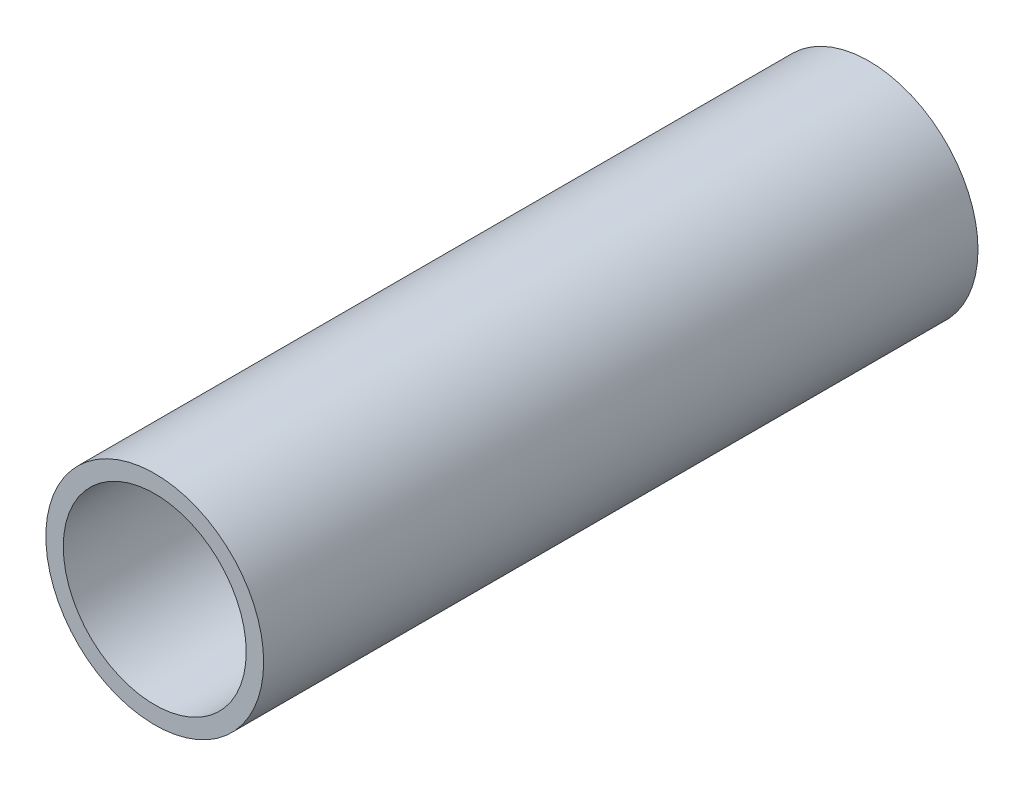
ISO-10303-21;
HEADER;
FILE_DESCRIPTION(('STEP AP214'),'2;1');
FILE_NAME('part.step','',(''),(''),'','','');
FILE_SCHEMA(('AUTOMOTIVE_DESIGN { 1 0 10303 214 1 1 1 1 }'));
ENDSEC;
DATA;
#1=APPLICATION_CONTEXT('core data for automotive mechanical design processes');
#2=APPLICATION_PROTOCOL_DEFINITION('international standard','automotive_design',2000,#1);
#3=PRODUCT_CONTEXT('',#1,'mechanical');
#4=PRODUCT('Part','Part','',(#3));
#5=PRODUCT_RELATED_PRODUCT_CATEGORY('part','',(#4));
#6=PRODUCT_DEFINITION_FORMATION('','',#4);
#7=PRODUCT_DEFINITION_CONTEXT('part definition',#1,'design');
#8=PRODUCT_DEFINITION('design','',#6,#7);
#9=PRODUCT_DEFINITION_SHAPE('','',#8);
#10=(LENGTH_UNIT() NAMED_UNIT(*) SI_UNIT(.MILLI.,.METRE.));
#11=(NAMED_UNIT(*) PLANE_ANGLE_UNIT() SI_UNIT($,.RADIAN.));
#12=(NAMED_UNIT(*) SI_UNIT($,.STERADIAN.) SOLID_ANGLE_UNIT());
#13=UNCERTAINTY_MEASURE_WITH_UNIT(LENGTH_MEASURE(1.E-05),#10,'distance_accuracy_value','');
#14=(GEOMETRIC_REPRESENTATION_CONTEXT(3) GLOBAL_UNCERTAINTY_ASSIGNED_CONTEXT((#13)) GLOBAL_UNIT_ASSIGNED_CONTEXT((#10,
#11,#12)) REPRESENTATION_CONTEXT('',''));
#15=CARTESIAN_POINT('',(0.,0.,0.));
#16=DIRECTION('',(0.,0.,1.));
#17=DIRECTION('',(1.,0.,0.));
#18=AXIS2_PLACEMENT_3D('',#15,#16,#17);
#19=CARTESIAN_POINT('',(0.,0.,82.));
#20=DIRECTION('',(0.,0.,1.));
#21=DIRECTION('',(1.,0.,0.));
#22=AXIS2_PLACEMENT_3D('',#19,#20,#21);
#23=PLANE('',#22);
#24=CARTESIAN_POINT('',(0.,0.,82.));
#25=DIRECTION('',(0.,0.,1.));
#26=DIRECTION('',(1.,0.,0.));
#27=AXIS2_PLACEMENT_3D('',#24,#25,#26);
#28=CIRCLE('',#27,12.5);
#29=CARTESIAN_POINT('',(12.5,0.,82.));
#30=VERTEX_POINT('',#29);
#31=EDGE_CURVE('E10',#30,#30,#28,.T.);
#32=ORIENTED_EDGE('',*,*,#31,.T.);
#33=EDGE_LOOP('',(#32));
#34=FACE_BOUND('',#33,.T.);
#35=CARTESIAN_POINT('',(0.,0.,82.));
#36=DIRECTION('',(0.,0.,1.));
#37=DIRECTION('',(1.,0.,0.));
#38=AXIS2_PLACEMENT_3D('',#35,#36,#37);
#39=CIRCLE('',#38,10.5);
#40=CARTESIAN_POINT('',(10.5,0.,82.));
#41=VERTEX_POINT('',#40);
#42=EDGE_CURVE('E50',#41,#41,#39,.T.);
#43=ORIENTED_EDGE('',*,*,#42,.F.);
#44=EDGE_LOOP('',(#43));
#45=FACE_BOUND('',#44,.T.);
#46=ADVANCED_FACE('F37',(#34,#45),#23,.T.);
#47=CARTESIAN_POINT('',(0.,0.,0.));
#48=DIRECTION('',(0.,0.,1.));
#49=DIRECTION('',(1.,0.,0.));
#50=AXIS2_PLACEMENT_3D('',#47,#48,#49);
#51=PLANE('',#50);
#52=CARTESIAN_POINT('',(0.,0.,0.));
#53=DIRECTION('',(0.,0.,1.));
#54=DIRECTION('',(1.,0.,0.));
#55=AXIS2_PLACEMENT_3D('',#52,#53,#54);
#56=CIRCLE('',#55,12.5);
#57=CARTESIAN_POINT('',(12.5,0.,0.));
#58=VERTEX_POINT('',#57);
#59=EDGE_CURVE('E41',#58,#58,#56,.T.);
#60=ORIENTED_EDGE('',*,*,#59,.F.);
#61=EDGE_LOOP('',(#60));
#62=FACE_BOUND('',#61,.T.);
#63=CARTESIAN_POINT('',(0.,0.,0.));
#64=DIRECTION('',(0.,0.,1.));
#65=DIRECTION('',(1.,0.,0.));
#66=AXIS2_PLACEMENT_3D('',#63,#64,#65);
#67=CIRCLE('',#66,10.5);
#68=CARTESIAN_POINT('',(10.5,0.,0.));
#69=VERTEX_POINT('',#68);
#70=EDGE_CURVE('E52',#69,#69,#67,.T.);
#71=ORIENTED_EDGE('',*,*,#70,.T.);
#72=EDGE_LOOP('',(#71));
#73=FACE_BOUND('',#72,.T.);
#74=ADVANCED_FACE('F64',(#62,#73),#51,.F.);
#75=CARTESIAN_POINT('',(0.,0.,82.));
#76=DIRECTION('',(0.,0.,-1.));
#77=DIRECTION('',(-1.,0.,0.));
#78=AXIS2_PLACEMENT_3D('',#75,#76,#77);
#79=CYLINDRICAL_SURFACE('',#78,12.5);
#80=ORIENTED_EDGE('',*,*,#31,.F.);
#81=EDGE_LOOP('',(#80));
#82=FACE_BOUND('',#81,.T.);
#83=ORIENTED_EDGE('',*,*,#59,.T.);
#84=EDGE_LOOP('',(#83));
#85=FACE_BOUND('',#84,.T.);
#86=ADVANCED_FACE('F39',(#82,#85),#79,.T.);
#87=CARTESIAN_POINT('',(0.,0.,82.));
#88=DIRECTION('',(0.,0.,-1.));
#89=DIRECTION('',(-1.,0.,0.));
#90=AXIS2_PLACEMENT_3D('',#87,#88,#89);
#91=CYLINDRICAL_SURFACE('',#90,10.5);
#92=ORIENTED_EDGE('',*,*,#42,.T.);
#93=EDGE_LOOP('',(#92));
#94=FACE_BOUND('',#93,.T.);
#95=ORIENTED_EDGE('',*,*,#70,.F.);
#96=EDGE_LOOP('',(#95));
#97=FACE_BOUND('',#96,.T.);
#98=ADVANCED_FACE('F60',(#94,#97),#91,.F.);
#99=CLOSED_SHELL('',(#46,#74,#86,#98));
#100=MANIFOLD_SOLID_BREP('B2',#99);
#101=ADVANCED_BREP_SHAPE_REPRESENTATION('',(#18,#100),#14);
#102=SHAPE_DEFINITION_REPRESENTATION(#9,#101);
ENDSEC;
END-ISO-10303-21;
